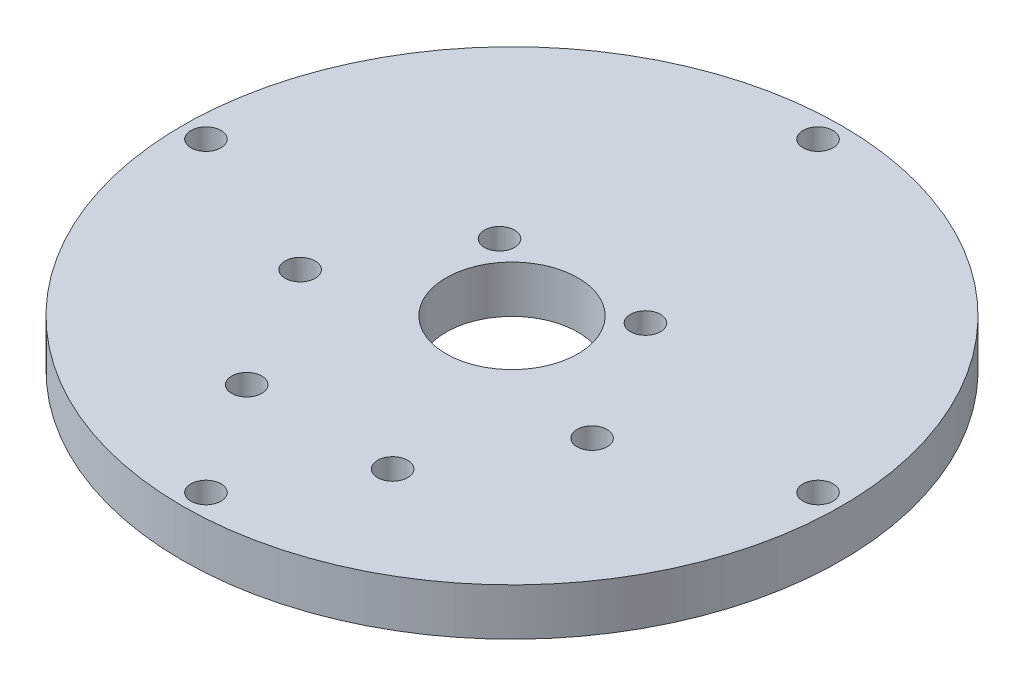
ISO-10303-21;
HEADER;
FILE_DESCRIPTION(('STEP AP214'),'2;1');
FILE_NAME('part.step','',(''),(''),'','','');
FILE_SCHEMA(('AUTOMOTIVE_DESIGN { 1 0 10303 214 1 1 1 1 }'));
ENDSEC;
DATA;
#1=APPLICATION_CONTEXT('core data for automotive mechanical design processes');
#2=APPLICATION_PROTOCOL_DEFINITION('international standard','automotive_design',2000,#1);
#3=PRODUCT_CONTEXT('',#1,'mechanical');
#4=PRODUCT('Part','Part','',(#3));
#5=PRODUCT_RELATED_PRODUCT_CATEGORY('part','',(#4));
#6=PRODUCT_DEFINITION_FORMATION('','',#4);
#7=PRODUCT_DEFINITION_CONTEXT('part definition',#1,'design');
#8=PRODUCT_DEFINITION('design','',#6,#7);
#9=PRODUCT_DEFINITION_SHAPE('','',#8);
#10=(LENGTH_UNIT() NAMED_UNIT(*) SI_UNIT(.MILLI.,.METRE.));
#11=(NAMED_UNIT(*) PLANE_ANGLE_UNIT() SI_UNIT($,.RADIAN.));
#12=(NAMED_UNIT(*) SI_UNIT($,.STERADIAN.) SOLID_ANGLE_UNIT());
#13=UNCERTAINTY_MEASURE_WITH_UNIT(LENGTH_MEASURE(1.E-05),#10,'distance_accuracy_value','');
#14=(GEOMETRIC_REPRESENTATION_CONTEXT(3) GLOBAL_UNCERTAINTY_ASSIGNED_CONTEXT((#13)) GLOBAL_UNIT_ASSIGNED_CONTEXT((#10,
#11,#12)) REPRESENTATION_CONTEXT('',''));
#15=CARTESIAN_POINT('',(0.,0.,0.));
#16=DIRECTION('',(0.,0.,1.));
#17=DIRECTION('',(1.,0.,0.));
#18=AXIS2_PLACEMENT_3D('',#15,#16,#17);
#19=CARTESIAN_POINT('',(0.,5.,0.));
#20=DIRECTION('',(0.,-1.,0.));
#21=DIRECTION('',(0.,0.,-1.));
#22=AXIS2_PLACEMENT_3D('',#19,#20,#21);
#23=CYLINDRICAL_SURFACE('',#22,35.);
#24=CARTESIAN_POINT('',(0.,5.,0.));
#25=DIRECTION('',(0.,1.,0.));
#26=DIRECTION('',(0.,0.,1.));
#27=AXIS2_PLACEMENT_3D('',#24,#25,#26);
#28=CIRCLE('',#27,35.);
#29=CARTESIAN_POINT('',(0.,5.,35.));
#30=VERTEX_POINT('',#29);
#31=EDGE_CURVE('E10',#30,#30,#28,.T.);
#32=ORIENTED_EDGE('',*,*,#31,.F.);
#33=EDGE_LOOP('',(#32));
#34=FACE_BOUND('',#33,.T.);
#35=CARTESIAN_POINT('',(0.,0.,0.));
#36=DIRECTION('',(0.,1.,0.));
#37=DIRECTION('',(0.,0.,1.));
#38=AXIS2_PLACEMENT_3D('',#35,#36,#37);
#39=CIRCLE('',#38,35.);
#40=CARTESIAN_POINT('',(0.,0.,35.));
#41=VERTEX_POINT('',#40);
#42=EDGE_CURVE('E36',#41,#41,#39,.T.);
#43=ORIENTED_EDGE('',*,*,#42,.T.);
#44=EDGE_LOOP('',(#43));
#45=FACE_BOUND('',#44,.T.);
#46=ADVANCED_FACE('F33',(#34,#45),#23,.T.);
#47=CARTESIAN_POINT('',(0.,5.,0.));
#48=DIRECTION('',(0.,1.,0.));
#49=DIRECTION('',(0.,0.,1.));
#50=AXIS2_PLACEMENT_3D('',#47,#48,#49);
#51=PLANE('',#50);
#52=CARTESIAN_POINT('',(-7.74999999999999,5.,20.4233937586588));
#53=DIRECTION('',(0.,1.,0.));
#54=DIRECTION('',(0.,0.,1.));
#55=AXIS2_PLACEMENT_3D('',#52,#53,#54);
#56=CIRCLE('',#55,1.60000000000006);
#57=CARTESIAN_POINT('',(-7.74999999999999,5.,22.0233937586589));
#58=VERTEX_POINT('',#57);
#59=EDGE_CURVE('E75',#58,#58,#56,.T.);
#60=ORIENTED_EDGE('',*,*,#59,.F.);
#61=EDGE_LOOP('',(#60));
#62=FACE_BOUND('',#61,.T.);
#63=CARTESIAN_POINT('',(7.75000000000001,5.,20.4233937586588));
#64=DIRECTION('',(0.,1.,0.));
#65=DIRECTION('',(0.,0.,1.));
#66=AXIS2_PLACEMENT_3D('',#63,#64,#65);
#67=CIRCLE('',#66,1.60000000000005);
#68=CARTESIAN_POINT('',(7.75000000000001,5.,22.0233937586588));
#69=VERTEX_POINT('',#68);
#70=EDGE_CURVE('E81',#69,#69,#67,.T.);
#71=ORIENTED_EDGE('',*,*,#70,.F.);
#72=EDGE_LOOP('',(#71));
#73=FACE_BOUND('',#72,.T.);
#74=CARTESIAN_POINT('',(15.5,5.,7.00000000000011));
#75=DIRECTION('',(0.,1.,0.));
#76=DIRECTION('',(0.,0.,1.));
#77=AXIS2_PLACEMENT_3D('',#74,#75,#76);
#78=CIRCLE('',#77,1.6);
#79=CARTESIAN_POINT('',(15.5,5.,8.60000000000011));
#80=VERTEX_POINT('',#79);
#81=EDGE_CURVE('E87',#80,#80,#78,.T.);
#82=ORIENTED_EDGE('',*,*,#81,.F.);
#83=EDGE_LOOP('',(#82));
#84=FACE_BOUND('',#83,.T.);
#85=CARTESIAN_POINT('',(7.75000000000006,5.,-6.42339375865877));
#86=DIRECTION('',(0.,1.,0.));
#87=DIRECTION('',(0.,0.,1.));
#88=AXIS2_PLACEMENT_3D('',#85,#86,#87);
#89=CIRCLE('',#88,1.6);
#90=CARTESIAN_POINT('',(7.75000000000006,5.,-4.82339375865877));
#91=VERTEX_POINT('',#90);
#92=EDGE_CURVE('E93',#91,#91,#89,.T.);
#93=ORIENTED_EDGE('',*,*,#92,.F.);
#94=EDGE_LOOP('',(#93));
#95=FACE_BOUND('',#94,.T.);
#96=CARTESIAN_POINT('',(-7.74999999999997,5.,-6.42339375865882));
#97=DIRECTION('',(0.,1.,0.));
#98=DIRECTION('',(0.,0.,1.));
#99=AXIS2_PLACEMENT_3D('',#96,#97,#98);
#100=CIRCLE('',#99,1.6);
#101=CARTESIAN_POINT('',(-7.74999999999997,5.,-4.82339375865882));
#102=VERTEX_POINT('',#101);
#103=EDGE_CURVE('E99',#102,#102,#100,.T.);
#104=ORIENTED_EDGE('',*,*,#103,.F.);
#105=EDGE_LOOP('',(#104));
#106=FACE_BOUND('',#105,.T.);
#107=CARTESIAN_POINT('',(-15.5,5.,7.));
#108=DIRECTION('',(0.,1.,0.));
#109=DIRECTION('',(0.,0.,1.));
#110=AXIS2_PLACEMENT_3D('',#107,#108,#109);
#111=CIRCLE('',#110,1.6);
#112=CARTESIAN_POINT('',(-15.5,5.,8.6));
#113=VERTEX_POINT('',#112);
#114=EDGE_CURVE('E105',#113,#113,#111,.T.);
#115=ORIENTED_EDGE('',*,*,#114,.F.);
#116=EDGE_LOOP('',(#115));
#117=FACE_BOUND('',#116,.T.);
#118=CARTESIAN_POINT('',(0.,5.,0.));
#119=DIRECTION('',(0.,1.,0.));
#120=DIRECTION('',(0.,0.,1.));
#121=AXIS2_PLACEMENT_3D('',#118,#119,#120);
#122=CIRCLE('',#121,7.);
#123=CARTESIAN_POINT('',(0.,5.,7.));
#124=VERTEX_POINT('',#123);
#125=EDGE_CURVE('E69',#124,#124,#122,.T.);
#126=ORIENTED_EDGE('',*,*,#125,.F.);
#127=EDGE_LOOP('',(#126));
#128=FACE_BOUND('',#127,.T.);
#129=CARTESIAN_POINT('',(-32.5,5.,0.));
#130=DIRECTION('',(0.,1.,0.));
#131=DIRECTION('',(0.,0.,1.));
#132=AXIS2_PLACEMENT_3D('',#129,#130,#131);
#133=CIRCLE('',#132,1.6);
#134=CARTESIAN_POINT('',(-32.5,5.,1.6));
#135=VERTEX_POINT('',#134);
#136=EDGE_CURVE('E64',#135,#135,#133,.T.);
#137=ORIENTED_EDGE('',*,*,#136,.F.);
#138=EDGE_LOOP('',(#137));
#139=FACE_BOUND('',#138,.T.);
#140=CARTESIAN_POINT('',(0.,5.,-32.5));
#141=DIRECTION('',(0.,1.,0.));
#142=DIRECTION('',(0.,0.,1.));
#143=AXIS2_PLACEMENT_3D('',#140,#141,#142);
#144=CIRCLE('',#143,1.6);
#145=CARTESIAN_POINT('',(0.,5.,-30.9));
#146=VERTEX_POINT('',#145);
#147=EDGE_CURVE('E58',#146,#146,#144,.T.);
#148=ORIENTED_EDGE('',*,*,#147,.F.);
#149=EDGE_LOOP('',(#148));
#150=FACE_BOUND('',#149,.T.);
#151=CARTESIAN_POINT('',(32.5,5.,0.));
#152=DIRECTION('',(0.,1.,0.));
#153=DIRECTION('',(0.,0.,1.));
#154=AXIS2_PLACEMENT_3D('',#151,#152,#153);
#155=CIRCLE('',#154,1.60000000000001);
#156=CARTESIAN_POINT('',(32.5,5.,1.60000000000001));
#157=VERTEX_POINT('',#156);
#158=EDGE_CURVE('E52',#157,#157,#155,.T.);
#159=ORIENTED_EDGE('',*,*,#158,.F.);
#160=EDGE_LOOP('',(#159));
#161=FACE_BOUND('',#160,.T.);
#162=CARTESIAN_POINT('',(0.,5.,32.5));
#163=DIRECTION('',(0.,1.,0.));
#164=DIRECTION('',(0.,0.,1.));
#165=AXIS2_PLACEMENT_3D('',#162,#163,#164);
#166=CIRCLE('',#165,1.6);
#167=CARTESIAN_POINT('',(0.,5.,34.1));
#168=VERTEX_POINT('',#167);
#169=EDGE_CURVE('E45',#168,#168,#166,.T.);
#170=ORIENTED_EDGE('',*,*,#169,.F.);
#171=EDGE_LOOP('',(#170));
#172=FACE_BOUND('',#171,.T.);
#173=ORIENTED_EDGE('',*,*,#31,.T.);
#174=EDGE_LOOP('',(#173));
#175=FACE_BOUND('',#174,.T.);
#176=ADVANCED_FACE('F122',(#62,#73,#84,#95,#106,#117,#128,#139,#150,#161,#172,#175),#51,.T.);
#177=CARTESIAN_POINT('',(0.,0.,0.));
#178=DIRECTION('',(0.,1.,0.));
#179=DIRECTION('',(0.,0.,1.));
#180=AXIS2_PLACEMENT_3D('',#177,#178,#179);
#181=PLANE('',#180);
#182=CARTESIAN_POINT('',(-7.74999999999999,0.,20.4233937586588));
#183=DIRECTION('',(0.,1.,0.));
#184=DIRECTION('',(0.,0.,1.));
#185=AXIS2_PLACEMENT_3D('',#182,#183,#184);
#186=CIRCLE('',#185,1.60000000000006);
#187=CARTESIAN_POINT('',(-7.74999999999999,0.,22.0233937586589));
#188=VERTEX_POINT('',#187);
#189=EDGE_CURVE('E78',#188,#188,#186,.T.);
#190=ORIENTED_EDGE('',*,*,#189,.T.);
#191=EDGE_LOOP('',(#190));
#192=FACE_BOUND('',#191,.T.);
#193=CARTESIAN_POINT('',(7.75000000000001,0.,20.4233937586588));
#194=DIRECTION('',(0.,1.,0.));
#195=DIRECTION('',(0.,0.,1.));
#196=AXIS2_PLACEMENT_3D('',#193,#194,#195);
#197=CIRCLE('',#196,1.60000000000005);
#198=CARTESIAN_POINT('',(7.75000000000001,0.,22.0233937586588));
#199=VERTEX_POINT('',#198);
#200=EDGE_CURVE('E84',#199,#199,#197,.T.);
#201=ORIENTED_EDGE('',*,*,#200,.T.);
#202=EDGE_LOOP('',(#201));
#203=FACE_BOUND('',#202,.T.);
#204=CARTESIAN_POINT('',(15.5,0.,7.00000000000011));
#205=DIRECTION('',(0.,1.,0.));
#206=DIRECTION('',(0.,0.,1.));
#207=AXIS2_PLACEMENT_3D('',#204,#205,#206);
#208=CIRCLE('',#207,1.6);
#209=CARTESIAN_POINT('',(15.5,0.,8.60000000000011));
#210=VERTEX_POINT('',#209);
#211=EDGE_CURVE('E90',#210,#210,#208,.T.);
#212=ORIENTED_EDGE('',*,*,#211,.T.);
#213=EDGE_LOOP('',(#212));
#214=FACE_BOUND('',#213,.T.);
#215=CARTESIAN_POINT('',(7.75000000000006,0.,-6.42339375865877));
#216=DIRECTION('',(0.,1.,0.));
#217=DIRECTION('',(0.,0.,1.));
#218=AXIS2_PLACEMENT_3D('',#215,#216,#217);
#219=CIRCLE('',#218,1.6);
#220=CARTESIAN_POINT('',(7.75000000000006,0.,-4.82339375865877));
#221=VERTEX_POINT('',#220);
#222=EDGE_CURVE('E96',#221,#221,#219,.T.);
#223=ORIENTED_EDGE('',*,*,#222,.T.);
#224=EDGE_LOOP('',(#223));
#225=FACE_BOUND('',#224,.T.);
#226=CARTESIAN_POINT('',(-7.74999999999997,0.,-6.42339375865882));
#227=DIRECTION('',(0.,1.,0.));
#228=DIRECTION('',(0.,0.,1.));
#229=AXIS2_PLACEMENT_3D('',#226,#227,#228);
#230=CIRCLE('',#229,1.6);
#231=CARTESIAN_POINT('',(-7.74999999999997,0.,-4.82339375865882));
#232=VERTEX_POINT('',#231);
#233=EDGE_CURVE('E102',#232,#232,#230,.T.);
#234=ORIENTED_EDGE('',*,*,#233,.T.);
#235=EDGE_LOOP('',(#234));
#236=FACE_BOUND('',#235,.T.);
#237=CARTESIAN_POINT('',(-15.5,0.,7.));
#238=DIRECTION('',(0.,1.,0.));
#239=DIRECTION('',(0.,0.,1.));
#240=AXIS2_PLACEMENT_3D('',#237,#238,#239);
#241=CIRCLE('',#240,1.6);
#242=CARTESIAN_POINT('',(-15.5,0.,8.6));
#243=VERTEX_POINT('',#242);
#244=EDGE_CURVE('E72',#243,#243,#241,.T.);
#245=ORIENTED_EDGE('',*,*,#244,.T.);
#246=EDGE_LOOP('',(#245));
#247=FACE_BOUND('',#246,.T.);
#248=CARTESIAN_POINT('',(0.,0.,0.));
#249=DIRECTION('',(0.,1.,0.));
#250=DIRECTION('',(0.,0.,1.));
#251=AXIS2_PLACEMENT_3D('',#248,#249,#250);
#252=CIRCLE('',#251,7.);
#253=CARTESIAN_POINT('',(0.,0.,7.));
#254=VERTEX_POINT('',#253);
#255=EDGE_CURVE('E49',#254,#254,#252,.T.);
#256=ORIENTED_EDGE('',*,*,#255,.T.);
#257=EDGE_LOOP('',(#256));
#258=FACE_BOUND('',#257,.T.);
#259=CARTESIAN_POINT('',(-32.5,0.,0.));
#260=DIRECTION('',(0.,1.,0.));
#261=DIRECTION('',(0.,0.,1.));
#262=AXIS2_PLACEMENT_3D('',#259,#260,#261);
#263=CIRCLE('',#262,1.6);
#264=CARTESIAN_POINT('',(-32.5,0.,1.6));
#265=VERTEX_POINT('',#264);
#266=EDGE_CURVE('E43',#265,#265,#263,.T.);
#267=ORIENTED_EDGE('',*,*,#266,.T.);
#268=EDGE_LOOP('',(#267));
#269=FACE_BOUND('',#268,.T.);
#270=CARTESIAN_POINT('',(0.,0.,-32.5));
#271=DIRECTION('',(0.,1.,0.));
#272=DIRECTION('',(0.,0.,1.));
#273=AXIS2_PLACEMENT_3D('',#270,#271,#272);
#274=CIRCLE('',#273,1.6);
#275=CARTESIAN_POINT('',(0.,0.,-30.9));
#276=VERTEX_POINT('',#275);
#277=EDGE_CURVE('E61',#276,#276,#274,.T.);
#278=ORIENTED_EDGE('',*,*,#277,.T.);
#279=EDGE_LOOP('',(#278));
#280=FACE_BOUND('',#279,.T.);
#281=CARTESIAN_POINT('',(32.5,0.,0.));
#282=DIRECTION('',(0.,1.,0.));
#283=DIRECTION('',(0.,0.,1.));
#284=AXIS2_PLACEMENT_3D('',#281,#282,#283);
#285=CIRCLE('',#284,1.60000000000001);
#286=CARTESIAN_POINT('',(32.5,0.,1.60000000000001));
#287=VERTEX_POINT('',#286);
#288=EDGE_CURVE('E55',#287,#287,#285,.T.);
#289=ORIENTED_EDGE('',*,*,#288,.T.);
#290=EDGE_LOOP('',(#289));
#291=FACE_BOUND('',#290,.T.);
#292=CARTESIAN_POINT('',(0.,0.,32.5));
#293=DIRECTION('',(0.,1.,0.));
#294=DIRECTION('',(0.,0.,1.));
#295=AXIS2_PLACEMENT_3D('',#292,#293,#294);
#296=CIRCLE('',#295,1.6);
#297=CARTESIAN_POINT('',(0.,0.,34.1));
#298=VERTEX_POINT('',#297);
#299=EDGE_CURVE('E48',#298,#298,#296,.T.);
#300=ORIENTED_EDGE('',*,*,#299,.T.);
#301=EDGE_LOOP('',(#300));
#302=FACE_BOUND('',#301,.T.);
#303=ORIENTED_EDGE('',*,*,#42,.F.);
#304=EDGE_LOOP('',(#303));
#305=FACE_BOUND('',#304,.T.);
#306=ADVANCED_FACE('F111',(#192,#203,#214,#225,#236,#247,#258,#269,#280,#291,#302,#305),#181,.F.);
#307=CARTESIAN_POINT('',(0.,0.,32.5));
#308=DIRECTION('',(0.,1.,0.));
#309=DIRECTION('',(0.,0.,1.));
#310=AXIS2_PLACEMENT_3D('',#307,#308,#309);
#311=CYLINDRICAL_SURFACE('',#310,1.6);
#312=ORIENTED_EDGE('',*,*,#299,.F.);
#313=EDGE_LOOP('',(#312));
#314=FACE_BOUND('',#313,.T.);
#315=ORIENTED_EDGE('',*,*,#169,.T.);
#316=EDGE_LOOP('',(#315));
#317=FACE_BOUND('',#316,.T.);
#318=ADVANCED_FACE('F137',(#314,#317),#311,.F.);
#319=CARTESIAN_POINT('',(32.5,0.,0.));
#320=DIRECTION('',(0.,1.,0.));
#321=DIRECTION('',(0.,0.,1.));
#322=AXIS2_PLACEMENT_3D('',#319,#320,#321);
#323=CYLINDRICAL_SURFACE('',#322,1.60000000000001);
#324=ORIENTED_EDGE('',*,*,#288,.F.);
#325=EDGE_LOOP('',(#324));
#326=FACE_BOUND('',#325,.T.);
#327=ORIENTED_EDGE('',*,*,#158,.T.);
#328=EDGE_LOOP('',(#327));
#329=FACE_BOUND('',#328,.T.);
#330=ADVANCED_FACE('F139',(#326,#329),#323,.F.);
#331=CARTESIAN_POINT('',(0.,0.,-32.5));
#332=DIRECTION('',(0.,1.,0.));
#333=DIRECTION('',(0.,0.,1.));
#334=AXIS2_PLACEMENT_3D('',#331,#332,#333);
#335=CYLINDRICAL_SURFACE('',#334,1.6);
#336=ORIENTED_EDGE('',*,*,#277,.F.);
#337=EDGE_LOOP('',(#336));
#338=FACE_BOUND('',#337,.T.);
#339=ORIENTED_EDGE('',*,*,#147,.T.);
#340=EDGE_LOOP('',(#339));
#341=FACE_BOUND('',#340,.T.);
#342=ADVANCED_FACE('F146',(#338,#341),#335,.F.);
#343=CARTESIAN_POINT('',(-32.5,0.,0.));
#344=DIRECTION('',(0.,1.,0.));
#345=DIRECTION('',(0.,0.,1.));
#346=AXIS2_PLACEMENT_3D('',#343,#344,#345);
#347=CYLINDRICAL_SURFACE('',#346,1.6);
#348=ORIENTED_EDGE('',*,*,#266,.F.);
#349=EDGE_LOOP('',(#348));
#350=FACE_BOUND('',#349,.T.);
#351=ORIENTED_EDGE('',*,*,#136,.T.);
#352=EDGE_LOOP('',(#351));
#353=FACE_BOUND('',#352,.T.);
#354=ADVANCED_FACE('F177',(#350,#353),#347,.F.);
#355=CARTESIAN_POINT('',(0.,0.,0.));
#356=DIRECTION('',(0.,1.,0.));
#357=DIRECTION('',(0.,0.,1.));
#358=AXIS2_PLACEMENT_3D('',#355,#356,#357);
#359=CYLINDRICAL_SURFACE('',#358,7.);
#360=ORIENTED_EDGE('',*,*,#255,.F.);
#361=EDGE_LOOP('',(#360));
#362=FACE_BOUND('',#361,.T.);
#363=ORIENTED_EDGE('',*,*,#125,.T.);
#364=EDGE_LOOP('',(#363));
#365=FACE_BOUND('',#364,.T.);
#366=ADVANCED_FACE('F118',(#362,#365),#359,.F.);
#367=CARTESIAN_POINT('',(-15.5,0.,7.));
#368=DIRECTION('',(0.,1.,0.));
#369=DIRECTION('',(0.,0.,1.));
#370=AXIS2_PLACEMENT_3D('',#367,#368,#369);
#371=CYLINDRICAL_SURFACE('',#370,1.6);
#372=ORIENTED_EDGE('',*,*,#244,.F.);
#373=EDGE_LOOP('',(#372));
#374=FACE_BOUND('',#373,.T.);
#375=ORIENTED_EDGE('',*,*,#114,.T.);
#376=EDGE_LOOP('',(#375));
#377=FACE_BOUND('',#376,.T.);
#378=ADVANCED_FACE('F114',(#374,#377),#371,.F.);
#379=CARTESIAN_POINT('',(-7.74999999999997,0.,-6.42339375865882));
#380=DIRECTION('',(0.,1.,0.));
#381=DIRECTION('',(0.,0.,1.));
#382=AXIS2_PLACEMENT_3D('',#379,#380,#381);
#383=CYLINDRICAL_SURFACE('',#382,1.6);
#384=ORIENTED_EDGE('',*,*,#233,.F.);
#385=EDGE_LOOP('',(#384));
#386=FACE_BOUND('',#385,.T.);
#387=ORIENTED_EDGE('',*,*,#103,.T.);
#388=EDGE_LOOP('',(#387));
#389=FACE_BOUND('',#388,.T.);
#390=ADVANCED_FACE('F117',(#386,#389),#383,.F.);
#391=CARTESIAN_POINT('',(7.75000000000006,0.,-6.42339375865877));
#392=DIRECTION('',(0.,1.,0.));
#393=DIRECTION('',(0.,0.,1.));
#394=AXIS2_PLACEMENT_3D('',#391,#392,#393);
#395=CYLINDRICAL_SURFACE('',#394,1.6);
#396=ORIENTED_EDGE('',*,*,#222,.F.);
#397=EDGE_LOOP('',(#396));
#398=FACE_BOUND('',#397,.T.);
#399=ORIENTED_EDGE('',*,*,#92,.T.);
#400=EDGE_LOOP('',(#399));
#401=FACE_BOUND('',#400,.T.);
#402=ADVANCED_FACE('F195',(#398,#401),#395,.F.);
#403=CARTESIAN_POINT('',(15.5,0.,7.00000000000011));
#404=DIRECTION('',(0.,1.,0.));
#405=DIRECTION('',(0.,0.,1.));
#406=AXIS2_PLACEMENT_3D('',#403,#404,#405);
#407=CYLINDRICAL_SURFACE('',#406,1.6);
#408=ORIENTED_EDGE('',*,*,#211,.F.);
#409=EDGE_LOOP('',(#408));
#410=FACE_BOUND('',#409,.T.);
#411=ORIENTED_EDGE('',*,*,#81,.T.);
#412=EDGE_LOOP('',(#411));
#413=FACE_BOUND('',#412,.T.);
#414=ADVANCED_FACE('F205',(#410,#413),#407,.F.);
#415=CARTESIAN_POINT('',(7.75000000000001,0.,20.4233937586588));
#416=DIRECTION('',(0.,1.,0.));
#417=DIRECTION('',(0.,0.,1.));
#418=AXIS2_PLACEMENT_3D('',#415,#416,#417);
#419=CYLINDRICAL_SURFACE('',#418,1.60000000000005);
#420=ORIENTED_EDGE('',*,*,#200,.F.);
#421=EDGE_LOOP('',(#420));
#422=FACE_BOUND('',#421,.T.);
#423=ORIENTED_EDGE('',*,*,#70,.T.);
#424=EDGE_LOOP('',(#423));
#425=FACE_BOUND('',#424,.T.);
#426=ADVANCED_FACE('F215',(#422,#425),#419,.F.);
#427=CARTESIAN_POINT('',(-7.74999999999999,0.,20.4233937586588));
#428=DIRECTION('',(0.,1.,0.));
#429=DIRECTION('',(0.,0.,1.));
#430=AXIS2_PLACEMENT_3D('',#427,#428,#429);
#431=CYLINDRICAL_SURFACE('',#430,1.60000000000006);
#432=ORIENTED_EDGE('',*,*,#189,.F.);
#433=EDGE_LOOP('',(#432));
#434=FACE_BOUND('',#433,.T.);
#435=ORIENTED_EDGE('',*,*,#59,.T.);
#436=EDGE_LOOP('',(#435));
#437=FACE_BOUND('',#436,.T.);
#438=ADVANCED_FACE('F225',(#434,#437),#431,.F.);
#439=CLOSED_SHELL('',(#46,#176,#306,#318,#330,#342,#354,#366,#378,#390,#402,#414,#426,#438));
#440=MANIFOLD_SOLID_BREP('B2',#439);
#441=ADVANCED_BREP_SHAPE_REPRESENTATION('',(#18,#440),#14);
#442=SHAPE_DEFINITION_REPRESENTATION(#9,#441);
ENDSEC;
END-ISO-10303-21;
